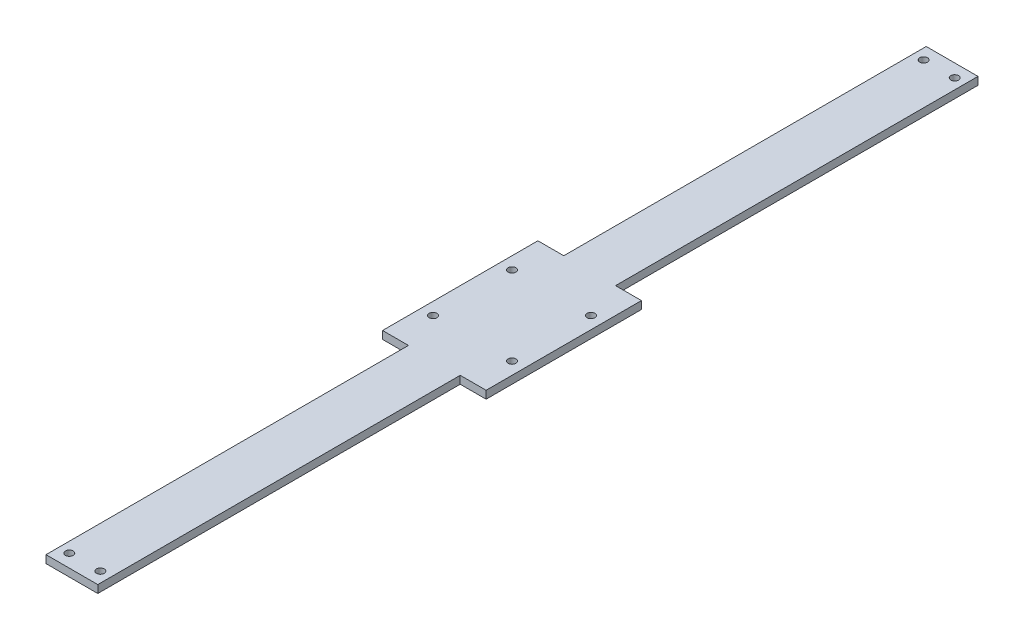
ISO-10303-21;
HEADER;
FILE_DESCRIPTION(('STEP AP214'),'2;1');
FILE_NAME('part.step','',(''),(''),'','','');
FILE_SCHEMA(('AUTOMOTIVE_DESIGN { 1 0 10303 214 1 1 1 1 }'));
ENDSEC;
DATA;
#1=APPLICATION_CONTEXT('core data for automotive mechanical design processes');
#2=APPLICATION_PROTOCOL_DEFINITION('international standard','automotive_design',2000,#1);
#3=PRODUCT_CONTEXT('',#1,'mechanical');
#4=PRODUCT('Part','Part','',(#3));
#5=PRODUCT_RELATED_PRODUCT_CATEGORY('part','',(#4));
#6=PRODUCT_DEFINITION_FORMATION('','',#4);
#7=PRODUCT_DEFINITION_CONTEXT('part definition',#1,'design');
#8=PRODUCT_DEFINITION('design','',#6,#7);
#9=PRODUCT_DEFINITION_SHAPE('','',#8);
#10=(LENGTH_UNIT() NAMED_UNIT(*) SI_UNIT(.MILLI.,.METRE.));
#11=(NAMED_UNIT(*) PLANE_ANGLE_UNIT() SI_UNIT($,.RADIAN.));
#12=(NAMED_UNIT(*) SI_UNIT($,.STERADIAN.) SOLID_ANGLE_UNIT());
#13=UNCERTAINTY_MEASURE_WITH_UNIT(LENGTH_MEASURE(1.E-05),#10,'distance_accuracy_value','');
#14=(GEOMETRIC_REPRESENTATION_CONTEXT(3) GLOBAL_UNCERTAINTY_ASSIGNED_CONTEXT((#13)) GLOBAL_UNIT_ASSIGNED_CONTEXT((#10,
#11,#12)) REPRESENTATION_CONTEXT('',''));
#15=CARTESIAN_POINT('',(0.,0.,0.));
#16=DIRECTION('',(0.,0.,1.));
#17=DIRECTION('',(1.,0.,0.));
#18=AXIS2_PLACEMENT_3D('',#15,#16,#17);
#19=CARTESIAN_POINT('',(0.,1.5,0.));
#20=DIRECTION('',(0.,-1.,0.));
#21=DIRECTION('',(0.,0.,-1.));
#22=AXIS2_PLACEMENT_3D('',#19,#20,#21);
#23=PLANE('',#22);
#24=CARTESIAN_POINT('',(-5.99999999999996,1.5,165.));
#25=DIRECTION('',(0.,1.,0.));
#26=DIRECTION('',(0.,0.,-1.));
#27=AXIS2_PLACEMENT_3D('',#24,#25,#26);
#28=CIRCLE('',#27,1.5);
#29=CARTESIAN_POINT('',(-5.99999999999996,1.5,163.5));
#30=VERTEX_POINT('',#29);
#31=EDGE_CURVE('E300',#30,#30,#28,.T.);
#32=ORIENTED_EDGE('',*,*,#31,.F.);
#33=EDGE_LOOP('',(#32));
#34=FACE_BOUND('',#33,.T.);
#35=CARTESIAN_POINT('',(6.00000000000004,1.5,165.));
#36=DIRECTION('',(0.,1.,0.));
#37=DIRECTION('',(0.,0.,-1.));
#38=AXIS2_PLACEMENT_3D('',#35,#36,#37);
#39=CIRCLE('',#38,1.5);
#40=CARTESIAN_POINT('',(6.00000000000004,1.5,163.5));
#41=VERTEX_POINT('',#40);
#42=EDGE_CURVE('E304',#41,#41,#39,.T.);
#43=ORIENTED_EDGE('',*,*,#42,.F.);
#44=EDGE_LOOP('',(#43));
#45=FACE_BOUND('',#44,.T.);
#46=CARTESIAN_POINT('',(-6.00000000000004,1.5,-165.));
#47=DIRECTION('',(0.,1.,0.));
#48=DIRECTION('',(0.,0.,1.));
#49=AXIS2_PLACEMENT_3D('',#46,#47,#48);
#50=CIRCLE('',#49,1.5);
#51=CARTESIAN_POINT('',(-6.00000000000004,1.5,-163.5));
#52=VERTEX_POINT('',#51);
#53=EDGE_CURVE('E311',#52,#52,#50,.T.);
#54=ORIENTED_EDGE('',*,*,#53,.F.);
#55=EDGE_LOOP('',(#54));
#56=FACE_BOUND('',#55,.T.);
#57=CARTESIAN_POINT('',(5.99999999999996,1.5,-165.));
#58=DIRECTION('',(0.,1.,0.));
#59=DIRECTION('',(0.,0.,1.));
#60=AXIS2_PLACEMENT_3D('',#57,#58,#59);
#61=CIRCLE('',#60,1.5);
#62=CARTESIAN_POINT('',(5.99999999999996,1.5,-163.5));
#63=VERTEX_POINT('',#62);
#64=EDGE_CURVE('E310',#63,#63,#61,.T.);
#65=ORIENTED_EDGE('',*,*,#64,.F.);
#66=EDGE_LOOP('',(#65));
#67=FACE_BOUND('',#66,.T.);
#68=DIRECTION('',(-1.,0.,0.));
#69=VECTOR('',#68,1.);
#70=CARTESIAN_POINT('',(-10.,1.5,-170.));
#71=LINE('',#70,#69);
#72=CARTESIAN_POINT('',(10.,1.5,-170.));
#73=VERTEX_POINT('',#72);
#74=CARTESIAN_POINT('',(-10.,1.5,-170.));
#75=VERTEX_POINT('',#74);
#76=EDGE_CURVE('E176',#73,#75,#71,.T.);
#77=ORIENTED_EDGE('',*,*,#76,.T.);
#78=DIRECTION('',(0.,0.,1.));
#79=VECTOR('',#78,1.);
#80=CARTESIAN_POINT('',(-10.,1.5,-170.));
#81=LINE('',#80,#79);
#82=CARTESIAN_POINT('',(-10.,1.5,-30.0000000000001));
#83=VERTEX_POINT('',#82);
#84=EDGE_CURVE('E104',#75,#83,#81,.T.);
#85=ORIENTED_EDGE('',*,*,#84,.T.);
#86=DIRECTION('',(-1.,0.,0.));
#87=VECTOR('',#86,1.);
#88=CARTESIAN_POINT('',(-10.,1.5,-30.0000000000001));
#89=LINE('',#88,#87);
#90=CARTESIAN_POINT('',(-20.0000000000001,1.5,-29.9999999999999));
#91=VERTEX_POINT('',#90);
#92=EDGE_CURVE('E203',#83,#91,#89,.T.);
#93=ORIENTED_EDGE('',*,*,#92,.T.);
#94=DIRECTION('',(0.,0.,1.));
#95=VECTOR('',#94,1.);
#96=CARTESIAN_POINT('',(-20.0000000000001,1.5,-29.9999999999999));
#97=LINE('',#96,#95);
#98=CARTESIAN_POINT('',(-20.,1.5,29.9999999999999));
#99=VERTEX_POINT('',#98);
#100=EDGE_CURVE('E222',#91,#99,#97,.T.);
#101=ORIENTED_EDGE('',*,*,#100,.T.);
#102=DIRECTION('',(1.,0.,0.));
#103=VECTOR('',#102,1.);
#104=CARTESIAN_POINT('',(-10.,1.5,29.9999999999999));
#105=LINE('',#104,#103);
#106=CARTESIAN_POINT('',(-10.,1.5,29.9999999999999));
#107=VERTEX_POINT('',#106);
#108=EDGE_CURVE('E219',#99,#107,#105,.T.);
#109=ORIENTED_EDGE('',*,*,#108,.T.);
#110=DIRECTION('',(0.,0.,1.));
#111=VECTOR('',#110,1.);
#112=CARTESIAN_POINT('',(-9.99999999999996,1.5,170.));
#113=LINE('',#112,#111);
#114=CARTESIAN_POINT('',(-9.99999999999996,1.5,170.));
#115=VERTEX_POINT('',#114);
#116=EDGE_CURVE('E221',#107,#115,#113,.T.);
#117=ORIENTED_EDGE('',*,*,#116,.T.);
#118=DIRECTION('',(1.,0.,0.));
#119=VECTOR('',#118,1.);
#120=CARTESIAN_POINT('',(-9.99999999999996,1.5,170.));
#121=LINE('',#120,#119);
#122=CARTESIAN_POINT('',(10.,1.5,170.));
#123=VERTEX_POINT('',#122);
#124=EDGE_CURVE('E224',#115,#123,#121,.T.);
#125=ORIENTED_EDGE('',*,*,#124,.T.);
#126=DIRECTION('',(0.,0.,-1.));
#127=VECTOR('',#126,1.);
#128=CARTESIAN_POINT('',(10.,1.5,170.));
#129=LINE('',#128,#127);
#130=CARTESIAN_POINT('',(9.99999999999997,1.5,29.9999999999999));
#131=VERTEX_POINT('',#130);
#132=EDGE_CURVE('E230',#123,#131,#129,.T.);
#133=ORIENTED_EDGE('',*,*,#132,.T.);
#134=DIRECTION('',(1.,0.,0.));
#135=VECTOR('',#134,1.);
#136=CARTESIAN_POINT('',(9.99999999999997,1.5,29.9999999999999));
#137=LINE('',#136,#135);
#138=CARTESIAN_POINT('',(20.0000000000001,1.5,29.9999999999999));
#139=VERTEX_POINT('',#138);
#140=EDGE_CURVE('E135',#131,#139,#137,.T.);
#141=ORIENTED_EDGE('',*,*,#140,.T.);
#142=DIRECTION('',(0.,0.,-1.));
#143=VECTOR('',#142,1.);
#144=CARTESIAN_POINT('',(20.0000000000001,1.5,-29.9999999999999));
#145=LINE('',#144,#143);
#146=CARTESIAN_POINT('',(20.0000000000001,1.5,-29.9999999999999));
#147=VERTEX_POINT('',#146);
#148=EDGE_CURVE('E129',#139,#147,#145,.T.);
#149=ORIENTED_EDGE('',*,*,#148,.T.);
#150=DIRECTION('',(-1.,0.,0.));
#151=VECTOR('',#150,1.);
#152=CARTESIAN_POINT('',(9.99999999999996,1.5,-30.));
#153=LINE('',#152,#151);
#154=CARTESIAN_POINT('',(9.99999999999996,1.5,-30.));
#155=VERTEX_POINT('',#154);
#156=EDGE_CURVE('E133',#147,#155,#153,.T.);
#157=ORIENTED_EDGE('',*,*,#156,.T.);
#158=DIRECTION('',(0.,0.,-1.));
#159=VECTOR('',#158,1.);
#160=CARTESIAN_POINT('',(10.,1.5,-170.));
#161=LINE('',#160,#159);
#162=EDGE_CURVE('E49',#155,#73,#161,.T.);
#163=ORIENTED_EDGE('',*,*,#162,.T.);
#164=EDGE_LOOP('',(#77,#85,#93,#101,#109,#117,#125,#133,#141,#149,#157,#163));
#165=FACE_BOUND('',#164,.T.);
#166=CARTESIAN_POINT('',(-15.25,1.5,-15.25));
#167=DIRECTION('',(0.,1.,0.));
#168=DIRECTION('',(0.,0.,1.));
#169=AXIS2_PLACEMENT_3D('',#166,#167,#168);
#170=CIRCLE('',#169,1.5);
#171=CARTESIAN_POINT('',(-15.25,1.5,-13.75));
#172=VERTEX_POINT('',#171);
#173=EDGE_CURVE('E157',#172,#172,#170,.T.);
#174=ORIENTED_EDGE('',*,*,#173,.F.);
#175=EDGE_LOOP('',(#174));
#176=FACE_BOUND('',#175,.T.);
#177=CARTESIAN_POINT('',(15.25,1.5,-15.25));
#178=DIRECTION('',(0.,1.,0.));
#179=DIRECTION('',(0.,0.,1.));
#180=AXIS2_PLACEMENT_3D('',#177,#178,#179);
#181=CIRCLE('',#180,1.5);
#182=CARTESIAN_POINT('',(15.25,1.5,-13.75));
#183=VERTEX_POINT('',#182);
#184=EDGE_CURVE('E335',#183,#183,#181,.T.);
#185=ORIENTED_EDGE('',*,*,#184,.F.);
#186=EDGE_LOOP('',(#185));
#187=FACE_BOUND('',#186,.T.);
#188=CARTESIAN_POINT('',(15.25,1.5,15.25));
#189=DIRECTION('',(0.,1.,0.));
#190=DIRECTION('',(0.,0.,1.));
#191=AXIS2_PLACEMENT_3D('',#188,#189,#190);
#192=CIRCLE('',#191,1.5);
#193=CARTESIAN_POINT('',(15.25,1.5,16.75));
#194=VERTEX_POINT('',#193);
#195=EDGE_CURVE('E329',#194,#194,#192,.T.);
#196=ORIENTED_EDGE('',*,*,#195,.F.);
#197=EDGE_LOOP('',(#196));
#198=FACE_BOUND('',#197,.T.);
#199=CARTESIAN_POINT('',(-15.25,1.5,15.25));
#200=DIRECTION('',(0.,1.,0.));
#201=DIRECTION('',(0.,0.,1.));
#202=AXIS2_PLACEMENT_3D('',#199,#200,#201);
#203=CIRCLE('',#202,1.5);
#204=CARTESIAN_POINT('',(-15.25,1.5,16.75));
#205=VERTEX_POINT('',#204);
#206=EDGE_CURVE('E323',#205,#205,#203,.T.);
#207=ORIENTED_EDGE('',*,*,#206,.F.);
#208=EDGE_LOOP('',(#207));
#209=FACE_BOUND('',#208,.T.);
#210=ADVANCED_FACE('F32',(#34,#45,#56,#67,#165,#176,#187,#198,#209),#23,.F.);
#211=CARTESIAN_POINT('',(0.,-1.5,0.));
#212=DIRECTION('',(0.,-1.,0.));
#213=DIRECTION('',(0.,0.,-1.));
#214=AXIS2_PLACEMENT_3D('',#211,#212,#213);
#215=PLANE('',#214);
#216=CARTESIAN_POINT('',(-5.99999999999996,-1.5,165.));
#217=DIRECTION('',(0.,1.,0.));
#218=DIRECTION('',(0.,0.,-1.));
#219=AXIS2_PLACEMENT_3D('',#216,#217,#218);
#220=CIRCLE('',#219,1.5);
#221=CARTESIAN_POINT('',(-5.99999999999996,-1.5,163.5));
#222=VERTEX_POINT('',#221);
#223=EDGE_CURVE('E298',#222,#222,#220,.T.);
#224=ORIENTED_EDGE('',*,*,#223,.T.);
#225=EDGE_LOOP('',(#224));
#226=FACE_BOUND('',#225,.T.);
#227=CARTESIAN_POINT('',(6.00000000000004,-1.5,165.));
#228=DIRECTION('',(0.,1.,0.));
#229=DIRECTION('',(0.,0.,-1.));
#230=AXIS2_PLACEMENT_3D('',#227,#228,#229);
#231=CIRCLE('',#230,1.5);
#232=CARTESIAN_POINT('',(6.00000000000004,-1.5,163.5));
#233=VERTEX_POINT('',#232);
#234=EDGE_CURVE('E301',#233,#233,#231,.T.);
#235=ORIENTED_EDGE('',*,*,#234,.T.);
#236=EDGE_LOOP('',(#235));
#237=FACE_BOUND('',#236,.T.);
#238=CARTESIAN_POINT('',(-6.00000000000004,-1.5,-165.));
#239=DIRECTION('',(0.,1.,0.));
#240=DIRECTION('',(0.,0.,1.));
#241=AXIS2_PLACEMENT_3D('',#238,#239,#240);
#242=CIRCLE('',#241,1.5);
#243=CARTESIAN_POINT('',(-6.00000000000004,-1.5,-163.5));
#244=VERTEX_POINT('',#243);
#245=EDGE_CURVE('E314',#244,#244,#242,.T.);
#246=ORIENTED_EDGE('',*,*,#245,.T.);
#247=EDGE_LOOP('',(#246));
#248=FACE_BOUND('',#247,.T.);
#249=CARTESIAN_POINT('',(5.99999999999996,-1.5,-165.));
#250=DIRECTION('',(0.,1.,0.));
#251=DIRECTION('',(0.,0.,1.));
#252=AXIS2_PLACEMENT_3D('',#249,#250,#251);
#253=CIRCLE('',#252,1.5);
#254=CARTESIAN_POINT('',(5.99999999999996,-1.5,-163.5));
#255=VERTEX_POINT('',#254);
#256=EDGE_CURVE('E315',#255,#255,#253,.T.);
#257=ORIENTED_EDGE('',*,*,#256,.T.);
#258=EDGE_LOOP('',(#257));
#259=FACE_BOUND('',#258,.T.);
#260=CARTESIAN_POINT('',(15.25,-1.5,15.25));
#261=DIRECTION('',(0.,1.,0.));
#262=DIRECTION('',(0.,0.,1.));
#263=AXIS2_PLACEMENT_3D('',#260,#261,#262);
#264=CIRCLE('',#263,1.5);
#265=CARTESIAN_POINT('',(15.25,-1.5,16.75));
#266=VERTEX_POINT('',#265);
#267=EDGE_CURVE('E326',#266,#266,#264,.T.);
#268=ORIENTED_EDGE('',*,*,#267,.T.);
#269=EDGE_LOOP('',(#268));
#270=FACE_BOUND('',#269,.T.);
#271=CARTESIAN_POINT('',(-15.25,-1.5,-15.25));
#272=DIRECTION('',(0.,1.,0.));
#273=DIRECTION('',(0.,0.,1.));
#274=AXIS2_PLACEMENT_3D('',#271,#272,#273);
#275=CIRCLE('',#274,1.5);
#276=CARTESIAN_POINT('',(-15.25,-1.5,-13.75));
#277=VERTEX_POINT('',#276);
#278=EDGE_CURVE('E338',#277,#277,#275,.T.);
#279=ORIENTED_EDGE('',*,*,#278,.T.);
#280=EDGE_LOOP('',(#279));
#281=FACE_BOUND('',#280,.T.);
#282=DIRECTION('',(-1.,0.,0.));
#283=VECTOR('',#282,1.);
#284=CARTESIAN_POINT('',(-10.,-1.5,-170.));
#285=LINE('',#284,#283);
#286=CARTESIAN_POINT('',(10.,-1.5,-170.));
#287=VERTEX_POINT('',#286);
#288=CARTESIAN_POINT('',(-10.,-1.5,-170.));
#289=VERTEX_POINT('',#288);
#290=EDGE_CURVE('E153',#287,#289,#285,.T.);
#291=ORIENTED_EDGE('',*,*,#290,.F.);
#292=DIRECTION('',(0.,0.,-1.));
#293=VECTOR('',#292,1.);
#294=CARTESIAN_POINT('',(10.,-1.5,-170.));
#295=LINE('',#294,#293);
#296=CARTESIAN_POINT('',(9.99999999999996,-1.5,-30.));
#297=VERTEX_POINT('',#296);
#298=EDGE_CURVE('E96',#297,#287,#295,.T.);
#299=ORIENTED_EDGE('',*,*,#298,.F.);
#300=DIRECTION('',(-1.,0.,0.));
#301=VECTOR('',#300,1.);
#302=CARTESIAN_POINT('',(9.99999999999996,-1.5,-30.));
#303=LINE('',#302,#301);
#304=CARTESIAN_POINT('',(20.0000000000001,-1.5,-29.9999999999999));
#305=VERTEX_POINT('',#304);
#306=EDGE_CURVE('E90',#305,#297,#303,.T.);
#307=ORIENTED_EDGE('',*,*,#306,.F.);
#308=DIRECTION('',(0.,0.,-1.));
#309=VECTOR('',#308,1.);
#310=CARTESIAN_POINT('',(20.0000000000001,-1.5,-29.9999999999999));
#311=LINE('',#310,#309);
#312=CARTESIAN_POINT('',(20.0000000000001,-1.5,29.9999999999999));
#313=VERTEX_POINT('',#312);
#314=EDGE_CURVE('E143',#313,#305,#311,.T.);
#315=ORIENTED_EDGE('',*,*,#314,.F.);
#316=DIRECTION('',(1.,0.,0.));
#317=VECTOR('',#316,1.);
#318=CARTESIAN_POINT('',(9.99999999999997,-1.5,29.9999999999999));
#319=LINE('',#318,#317);
#320=CARTESIAN_POINT('',(9.99999999999997,-1.5,29.9999999999999));
#321=VERTEX_POINT('',#320);
#322=EDGE_CURVE('E171',#321,#313,#319,.T.);
#323=ORIENTED_EDGE('',*,*,#322,.F.);
#324=DIRECTION('',(0.,0.,-1.));
#325=VECTOR('',#324,1.);
#326=CARTESIAN_POINT('',(10.,-1.5,170.));
#327=LINE('',#326,#325);
#328=CARTESIAN_POINT('',(10.,-1.5,170.));
#329=VERTEX_POINT('',#328);
#330=EDGE_CURVE('E169',#329,#321,#327,.T.);
#331=ORIENTED_EDGE('',*,*,#330,.F.);
#332=DIRECTION('',(1.,0.,0.));
#333=VECTOR('',#332,1.);
#334=CARTESIAN_POINT('',(-9.99999999999996,-1.5,170.));
#335=LINE('',#334,#333);
#336=CARTESIAN_POINT('',(-9.99999999999996,-1.5,170.));
#337=VERTEX_POINT('',#336);
#338=EDGE_CURVE('E167',#337,#329,#335,.T.);
#339=ORIENTED_EDGE('',*,*,#338,.F.);
#340=DIRECTION('',(0.,0.,1.));
#341=VECTOR('',#340,1.);
#342=CARTESIAN_POINT('',(-9.99999999999996,-1.5,170.));
#343=LINE('',#342,#341);
#344=CARTESIAN_POINT('',(-10.,-1.5,29.9999999999999));
#345=VERTEX_POINT('',#344);
#346=EDGE_CURVE('E165',#345,#337,#343,.T.);
#347=ORIENTED_EDGE('',*,*,#346,.F.);
#348=DIRECTION('',(1.,0.,0.));
#349=VECTOR('',#348,1.);
#350=CARTESIAN_POINT('',(-10.,-1.5,29.9999999999999));
#351=LINE('',#350,#349);
#352=CARTESIAN_POINT('',(-20.,-1.5,29.9999999999999));
#353=VERTEX_POINT('',#352);
#354=EDGE_CURVE('E163',#353,#345,#351,.T.);
#355=ORIENTED_EDGE('',*,*,#354,.F.);
#356=DIRECTION('',(0.,0.,1.));
#357=VECTOR('',#356,1.);
#358=CARTESIAN_POINT('',(-20.0000000000001,-1.5,-29.9999999999999));
#359=LINE('',#358,#357);
#360=CARTESIAN_POINT('',(-20.0000000000001,-1.5,-29.9999999999999));
#361=VERTEX_POINT('',#360);
#362=EDGE_CURVE('E161',#361,#353,#359,.T.);
#363=ORIENTED_EDGE('',*,*,#362,.F.);
#364=DIRECTION('',(-1.,0.,0.));
#365=VECTOR('',#364,1.);
#366=CARTESIAN_POINT('',(-10.,-1.5,-30.0000000000001));
#367=LINE('',#366,#365);
#368=CARTESIAN_POINT('',(-10.,-1.5,-30.0000000000001));
#369=VERTEX_POINT('',#368);
#370=EDGE_CURVE('E159',#369,#361,#367,.T.);
#371=ORIENTED_EDGE('',*,*,#370,.F.);
#372=DIRECTION('',(0.,0.,1.));
#373=VECTOR('',#372,1.);
#374=CARTESIAN_POINT('',(-10.,-1.5,-170.));
#375=LINE('',#374,#373);
#376=EDGE_CURVE('E156',#289,#369,#375,.T.);
#377=ORIENTED_EDGE('',*,*,#376,.F.);
#378=EDGE_LOOP('',(#291,#299,#307,#315,#323,#331,#339,#347,#355,#363,#371,#377));
#379=FACE_BOUND('',#378,.T.);
#380=CARTESIAN_POINT('',(15.25,-1.5,-15.25));
#381=DIRECTION('',(0.,1.,0.));
#382=DIRECTION('',(0.,0.,1.));
#383=AXIS2_PLACEMENT_3D('',#380,#381,#382);
#384=CIRCLE('',#383,1.5);
#385=CARTESIAN_POINT('',(15.25,-1.5,-13.75));
#386=VERTEX_POINT('',#385);
#387=EDGE_CURVE('E332',#386,#386,#384,.T.);
#388=ORIENTED_EDGE('',*,*,#387,.T.);
#389=EDGE_LOOP('',(#388));
#390=FACE_BOUND('',#389,.T.);
#391=CARTESIAN_POINT('',(-15.25,-1.5,15.25));
#392=DIRECTION('',(0.,1.,0.));
#393=DIRECTION('',(0.,0.,1.));
#394=AXIS2_PLACEMENT_3D('',#391,#392,#393);
#395=CIRCLE('',#394,1.5);
#396=CARTESIAN_POINT('',(-15.25,-1.5,16.75));
#397=VERTEX_POINT('',#396);
#398=EDGE_CURVE('E318',#397,#397,#395,.T.);
#399=ORIENTED_EDGE('',*,*,#398,.T.);
#400=EDGE_LOOP('',(#399));
#401=FACE_BOUND('',#400,.T.);
#402=ADVANCED_FACE('F207',(#226,#237,#248,#259,#270,#281,#379,#390,#401),#215,.T.);
#403=CARTESIAN_POINT('',(-10.,1.5,-170.));
#404=DIRECTION('',(0.,0.,1.));
#405=DIRECTION('',(1.,0.,0.));
#406=AXIS2_PLACEMENT_3D('',#403,#404,#405);
#407=PLANE('',#406);
#408=ORIENTED_EDGE('',*,*,#290,.T.);
#409=DIRECTION('',(0.,-1.,0.));
#410=VECTOR('',#409,1.);
#411=CARTESIAN_POINT('',(-10.,1.5,-170.));
#412=LINE('',#411,#410);
#413=EDGE_CURVE('E11',#75,#289,#412,.T.);
#414=ORIENTED_EDGE('',*,*,#413,.F.);
#415=ORIENTED_EDGE('',*,*,#76,.F.);
#416=DIRECTION('',(0.,-1.,0.));
#417=VECTOR('',#416,1.);
#418=CARTESIAN_POINT('',(10.,1.5,-170.));
#419=LINE('',#418,#417);
#420=EDGE_CURVE('E149',#73,#287,#419,.T.);
#421=ORIENTED_EDGE('',*,*,#420,.T.);
#422=EDGE_LOOP('',(#408,#414,#415,#421));
#423=FACE_BOUND('',#422,.T.);
#424=ADVANCED_FACE('F34',(#423),#407,.F.);
#425=CARTESIAN_POINT('',(-10.,1.5,-170.));
#426=DIRECTION('',(1.,0.,0.));
#427=DIRECTION('',(0.,0.,-1.));
#428=AXIS2_PLACEMENT_3D('',#425,#426,#427);
#429=PLANE('',#428);
#430=ORIENTED_EDGE('',*,*,#376,.T.);
#431=DIRECTION('',(0.,-1.,0.));
#432=VECTOR('',#431,1.);
#433=CARTESIAN_POINT('',(-10.,1.5,-30.0000000000001));
#434=LINE('',#433,#432);
#435=EDGE_CURVE('E41',#83,#369,#434,.T.);
#436=ORIENTED_EDGE('',*,*,#435,.F.);
#437=ORIENTED_EDGE('',*,*,#84,.F.);
#438=ORIENTED_EDGE('',*,*,#413,.T.);
#439=EDGE_LOOP('',(#430,#436,#437,#438));
#440=FACE_BOUND('',#439,.T.);
#441=ADVANCED_FACE('F486',(#440),#429,.F.);
#442=CARTESIAN_POINT('',(-10.,1.5,-30.0000000000001));
#443=DIRECTION('',(0.,0.,1.));
#444=DIRECTION('',(1.,0.,0.));
#445=AXIS2_PLACEMENT_3D('',#442,#443,#444);
#446=PLANE('',#445);
#447=ORIENTED_EDGE('',*,*,#370,.T.);
#448=DIRECTION('',(0.,-1.,0.));
#449=VECTOR('',#448,1.);
#450=CARTESIAN_POINT('',(-20.0000000000001,1.5,-29.9999999999999));
#451=LINE('',#450,#449);
#452=EDGE_CURVE('E195',#91,#361,#451,.T.);
#453=ORIENTED_EDGE('',*,*,#452,.F.);
#454=ORIENTED_EDGE('',*,*,#92,.F.);
#455=ORIENTED_EDGE('',*,*,#435,.T.);
#456=EDGE_LOOP('',(#447,#453,#454,#455));
#457=FACE_BOUND('',#456,.T.);
#458=ADVANCED_FACE('F201',(#457),#446,.F.);
#459=CARTESIAN_POINT('',(-20.0000000000001,1.5,-29.9999999999999));
#460=DIRECTION('',(1.,0.,0.));
#461=DIRECTION('',(0.,0.,-1.));
#462=AXIS2_PLACEMENT_3D('',#459,#460,#461);
#463=PLANE('',#462);
#464=ORIENTED_EDGE('',*,*,#362,.T.);
#465=DIRECTION('',(0.,-1.,0.));
#466=VECTOR('',#465,1.);
#467=CARTESIAN_POINT('',(-20.,1.5,29.9999999999999));
#468=LINE('',#467,#466);
#469=EDGE_CURVE('E192',#99,#353,#468,.T.);
#470=ORIENTED_EDGE('',*,*,#469,.F.);
#471=ORIENTED_EDGE('',*,*,#100,.F.);
#472=ORIENTED_EDGE('',*,*,#452,.T.);
#473=EDGE_LOOP('',(#464,#470,#471,#472));
#474=FACE_BOUND('',#473,.T.);
#475=ADVANCED_FACE('F213',(#474),#463,.F.);
#476=CARTESIAN_POINT('',(-10.,1.5,29.9999999999999));
#477=DIRECTION('',(0.,0.,-1.));
#478=DIRECTION('',(-1.,0.,0.));
#479=AXIS2_PLACEMENT_3D('',#476,#477,#478);
#480=PLANE('',#479);
#481=ORIENTED_EDGE('',*,*,#354,.T.);
#482=DIRECTION('',(0.,-1.,0.));
#483=VECTOR('',#482,1.);
#484=CARTESIAN_POINT('',(-10.,1.5,29.9999999999999));
#485=LINE('',#484,#483);
#486=EDGE_CURVE('E189',#107,#345,#485,.T.);
#487=ORIENTED_EDGE('',*,*,#486,.F.);
#488=ORIENTED_EDGE('',*,*,#108,.F.);
#489=ORIENTED_EDGE('',*,*,#469,.T.);
#490=EDGE_LOOP('',(#481,#487,#488,#489));
#491=FACE_BOUND('',#490,.T.);
#492=ADVANCED_FACE('F217',(#491),#480,.F.);
#493=CARTESIAN_POINT('',(-9.99999999999996,1.5,170.));
#494=DIRECTION('',(1.,0.,0.));
#495=DIRECTION('',(0.,0.,-1.));
#496=AXIS2_PLACEMENT_3D('',#493,#494,#495);
#497=PLANE('',#496);
#498=ORIENTED_EDGE('',*,*,#346,.T.);
#499=DIRECTION('',(0.,-1.,0.));
#500=VECTOR('',#499,1.);
#501=CARTESIAN_POINT('',(-9.99999999999996,1.5,170.));
#502=LINE('',#501,#500);
#503=EDGE_CURVE('E186',#115,#337,#502,.T.);
#504=ORIENTED_EDGE('',*,*,#503,.F.);
#505=ORIENTED_EDGE('',*,*,#116,.F.);
#506=ORIENTED_EDGE('',*,*,#486,.T.);
#507=EDGE_LOOP('',(#498,#504,#505,#506));
#508=FACE_BOUND('',#507,.T.);
#509=ADVANCED_FACE('F451',(#508),#497,.F.);
#510=CARTESIAN_POINT('',(-9.99999999999996,1.5,170.));
#511=DIRECTION('',(0.,0.,-1.));
#512=DIRECTION('',(-1.,0.,0.));
#513=AXIS2_PLACEMENT_3D('',#510,#511,#512);
#514=PLANE('',#513);
#515=ORIENTED_EDGE('',*,*,#338,.T.);
#516=DIRECTION('',(0.,-1.,0.));
#517=VECTOR('',#516,1.);
#518=CARTESIAN_POINT('',(10.,1.5,170.));
#519=LINE('',#518,#517);
#520=EDGE_CURVE('E183',#123,#329,#519,.T.);
#521=ORIENTED_EDGE('',*,*,#520,.F.);
#522=ORIENTED_EDGE('',*,*,#124,.F.);
#523=ORIENTED_EDGE('',*,*,#503,.T.);
#524=EDGE_LOOP('',(#515,#521,#522,#523));
#525=FACE_BOUND('',#524,.T.);
#526=ADVANCED_FACE('F442',(#525),#514,.F.);
#527=CARTESIAN_POINT('',(10.,1.5,170.));
#528=DIRECTION('',(-1.,0.,0.));
#529=DIRECTION('',(0.,0.,1.));
#530=AXIS2_PLACEMENT_3D('',#527,#528,#529);
#531=PLANE('',#530);
#532=ORIENTED_EDGE('',*,*,#330,.T.);
#533=DIRECTION('',(0.,-1.,0.));
#534=VECTOR('',#533,1.);
#535=CARTESIAN_POINT('',(9.99999999999997,1.5,29.9999999999999));
#536=LINE('',#535,#534);
#537=EDGE_CURVE('E180',#131,#321,#536,.T.);
#538=ORIENTED_EDGE('',*,*,#537,.F.);
#539=ORIENTED_EDGE('',*,*,#132,.F.);
#540=ORIENTED_EDGE('',*,*,#520,.T.);
#541=EDGE_LOOP('',(#532,#538,#539,#540));
#542=FACE_BOUND('',#541,.T.);
#543=ADVANCED_FACE('F236',(#542),#531,.F.);
#544=CARTESIAN_POINT('',(9.99999999999997,1.5,29.9999999999999));
#545=DIRECTION('',(0.,0.,-1.));
#546=DIRECTION('',(-1.,0.,0.));
#547=AXIS2_PLACEMENT_3D('',#544,#545,#546);
#548=PLANE('',#547);
#549=ORIENTED_EDGE('',*,*,#322,.T.);
#550=DIRECTION('',(0.,-1.,0.));
#551=VECTOR('',#550,1.);
#552=CARTESIAN_POINT('',(20.0000000000001,1.5,29.9999999999999));
#553=LINE('',#552,#551);
#554=EDGE_CURVE('E144',#139,#313,#553,.T.);
#555=ORIENTED_EDGE('',*,*,#554,.F.);
#556=ORIENTED_EDGE('',*,*,#140,.F.);
#557=ORIENTED_EDGE('',*,*,#537,.T.);
#558=EDGE_LOOP('',(#549,#555,#556,#557));
#559=FACE_BOUND('',#558,.T.);
#560=ADVANCED_FACE('F240',(#559),#548,.F.);
#561=CARTESIAN_POINT('',(20.0000000000001,1.5,-29.9999999999999));
#562=DIRECTION('',(-1.,0.,0.));
#563=DIRECTION('',(0.,0.,1.));
#564=AXIS2_PLACEMENT_3D('',#561,#562,#563);
#565=PLANE('',#564);
#566=ORIENTED_EDGE('',*,*,#314,.T.);
#567=DIRECTION('',(0.,-1.,0.));
#568=VECTOR('',#567,1.);
#569=CARTESIAN_POINT('',(20.0000000000001,1.5,-29.9999999999999));
#570=LINE('',#569,#568);
#571=EDGE_CURVE('E140',#147,#305,#570,.T.);
#572=ORIENTED_EDGE('',*,*,#571,.F.);
#573=ORIENTED_EDGE('',*,*,#148,.F.);
#574=ORIENTED_EDGE('',*,*,#554,.T.);
#575=EDGE_LOOP('',(#566,#572,#573,#574));
#576=FACE_BOUND('',#575,.T.);
#577=ADVANCED_FACE('F141',(#576),#565,.F.);
#578=CARTESIAN_POINT('',(9.99999999999996,1.5,-30.));
#579=DIRECTION('',(0.,0.,1.));
#580=DIRECTION('',(1.,0.,0.));
#581=AXIS2_PLACEMENT_3D('',#578,#579,#580);
#582=PLANE('',#581);
#583=ORIENTED_EDGE('',*,*,#306,.T.);
#584=DIRECTION('',(0.,-1.,0.));
#585=VECTOR('',#584,1.);
#586=CARTESIAN_POINT('',(9.99999999999996,1.5,-30.));
#587=LINE('',#586,#585);
#588=EDGE_CURVE('E145',#155,#297,#587,.T.);
#589=ORIENTED_EDGE('',*,*,#588,.F.);
#590=ORIENTED_EDGE('',*,*,#156,.F.);
#591=ORIENTED_EDGE('',*,*,#571,.T.);
#592=EDGE_LOOP('',(#583,#589,#590,#591));
#593=FACE_BOUND('',#592,.T.);
#594=ADVANCED_FACE('F147',(#593),#582,.F.);
#595=CARTESIAN_POINT('',(10.,1.5,-170.));
#596=DIRECTION('',(-1.,0.,0.));
#597=DIRECTION('',(0.,0.,1.));
#598=AXIS2_PLACEMENT_3D('',#595,#596,#597);
#599=PLANE('',#598);
#600=ORIENTED_EDGE('',*,*,#298,.T.);
#601=ORIENTED_EDGE('',*,*,#420,.F.);
#602=ORIENTED_EDGE('',*,*,#162,.F.);
#603=ORIENTED_EDGE('',*,*,#588,.T.);
#604=EDGE_LOOP('',(#600,#601,#602,#603));
#605=FACE_BOUND('',#604,.T.);
#606=ADVANCED_FACE('F244',(#605),#599,.F.);
#607=CARTESIAN_POINT('',(-15.25,1.5,-15.25));
#608=DIRECTION('',(0.,-1.,0.));
#609=DIRECTION('',(0.,0.,-1.));
#610=AXIS2_PLACEMENT_3D('',#607,#608,#609);
#611=CYLINDRICAL_SURFACE('',#610,1.5);
#612=ORIENTED_EDGE('',*,*,#173,.T.);
#613=EDGE_LOOP('',(#612));
#614=FACE_BOUND('',#613,.T.);
#615=ORIENTED_EDGE('',*,*,#278,.F.);
#616=EDGE_LOOP('',(#615));
#617=FACE_BOUND('',#616,.T.);
#618=ADVANCED_FACE('F246',(#614,#617),#611,.F.);
#619=CARTESIAN_POINT('',(15.25,1.5,-15.25));
#620=DIRECTION('',(0.,-1.,0.));
#621=DIRECTION('',(0.,0.,-1.));
#622=AXIS2_PLACEMENT_3D('',#619,#620,#621);
#623=CYLINDRICAL_SURFACE('',#622,1.5);
#624=ORIENTED_EDGE('',*,*,#184,.T.);
#625=EDGE_LOOP('',(#624));
#626=FACE_BOUND('',#625,.T.);
#627=ORIENTED_EDGE('',*,*,#387,.F.);
#628=EDGE_LOOP('',(#627));
#629=FACE_BOUND('',#628,.T.);
#630=ADVANCED_FACE('F252',(#626,#629),#623,.F.);
#631=CARTESIAN_POINT('',(15.25,1.5,15.25));
#632=DIRECTION('',(0.,-1.,0.));
#633=DIRECTION('',(0.,0.,-1.));
#634=AXIS2_PLACEMENT_3D('',#631,#632,#633);
#635=CYLINDRICAL_SURFACE('',#634,1.5);
#636=ORIENTED_EDGE('',*,*,#195,.T.);
#637=EDGE_LOOP('',(#636));
#638=FACE_BOUND('',#637,.T.);
#639=ORIENTED_EDGE('',*,*,#267,.F.);
#640=EDGE_LOOP('',(#639));
#641=FACE_BOUND('',#640,.T.);
#642=ADVANCED_FACE('F269',(#638,#641),#635,.F.);
#643=CARTESIAN_POINT('',(-15.25,1.5,15.25));
#644=DIRECTION('',(0.,-1.,0.));
#645=DIRECTION('',(0.,0.,-1.));
#646=AXIS2_PLACEMENT_3D('',#643,#644,#645);
#647=CYLINDRICAL_SURFACE('',#646,1.5);
#648=ORIENTED_EDGE('',*,*,#206,.T.);
#649=EDGE_LOOP('',(#648));
#650=FACE_BOUND('',#649,.T.);
#651=ORIENTED_EDGE('',*,*,#398,.F.);
#652=EDGE_LOOP('',(#651));
#653=FACE_BOUND('',#652,.T.);
#654=ADVANCED_FACE('F273',(#650,#653),#647,.F.);
#655=CARTESIAN_POINT('',(5.99999999999996,-1.5,-165.));
#656=DIRECTION('',(0.,1.,0.));
#657=DIRECTION('',(0.,0.,1.));
#658=AXIS2_PLACEMENT_3D('',#655,#656,#657);
#659=CYLINDRICAL_SURFACE('',#658,1.5);
#660=ORIENTED_EDGE('',*,*,#256,.F.);
#661=EDGE_LOOP('',(#660));
#662=FACE_BOUND('',#661,.T.);
#663=ORIENTED_EDGE('',*,*,#64,.T.);
#664=EDGE_LOOP('',(#663));
#665=FACE_BOUND('',#664,.T.);
#666=ADVANCED_FACE('F277',(#662,#665),#659,.F.);
#667=CARTESIAN_POINT('',(-6.00000000000004,-1.5,-165.));
#668=DIRECTION('',(0.,1.,0.));
#669=DIRECTION('',(0.,0.,1.));
#670=AXIS2_PLACEMENT_3D('',#667,#668,#669);
#671=CYLINDRICAL_SURFACE('',#670,1.5);
#672=ORIENTED_EDGE('',*,*,#245,.F.);
#673=EDGE_LOOP('',(#672));
#674=FACE_BOUND('',#673,.T.);
#675=ORIENTED_EDGE('',*,*,#53,.T.);
#676=EDGE_LOOP('',(#675));
#677=FACE_BOUND('',#676,.T.);
#678=ADVANCED_FACE('F281',(#674,#677),#671,.F.);
#679=CARTESIAN_POINT('',(6.00000000000004,-1.5,165.));
#680=DIRECTION('',(0.,1.,0.));
#681=DIRECTION('',(0.,0.,-1.));
#682=AXIS2_PLACEMENT_3D('',#679,#680,#681);
#683=CYLINDRICAL_SURFACE('',#682,1.5);
#684=ORIENTED_EDGE('',*,*,#234,.F.);
#685=EDGE_LOOP('',(#684));
#686=FACE_BOUND('',#685,.T.);
#687=ORIENTED_EDGE('',*,*,#42,.T.);
#688=EDGE_LOOP('',(#687));
#689=FACE_BOUND('',#688,.T.);
#690=ADVANCED_FACE('F285',(#686,#689),#683,.F.);
#691=CARTESIAN_POINT('',(-5.99999999999996,-1.5,165.));
#692=DIRECTION('',(0.,1.,0.));
#693=DIRECTION('',(0.,0.,-1.));
#694=AXIS2_PLACEMENT_3D('',#691,#692,#693);
#695=CYLINDRICAL_SURFACE('',#694,1.5);
#696=ORIENTED_EDGE('',*,*,#223,.F.);
#697=EDGE_LOOP('',(#696));
#698=FACE_BOUND('',#697,.T.);
#699=ORIENTED_EDGE('',*,*,#31,.T.);
#700=EDGE_LOOP('',(#699));
#701=FACE_BOUND('',#700,.T.);
#702=ADVANCED_FACE('F289',(#698,#701),#695,.F.);
#703=CLOSED_SHELL('',(#210,#402,#424,#441,#458,#475,#492,#509,#526,#543,#560,#577,#594,#606,
#618,#630,#642,#654,#666,#678,#690,#702));
#704=MANIFOLD_SOLID_BREP('B2',#703);
#705=ADVANCED_BREP_SHAPE_REPRESENTATION('',(#18,#704),#14);
#706=SHAPE_DEFINITION_REPRESENTATION(#9,#705);
ENDSEC;
END-ISO-10303-21;
